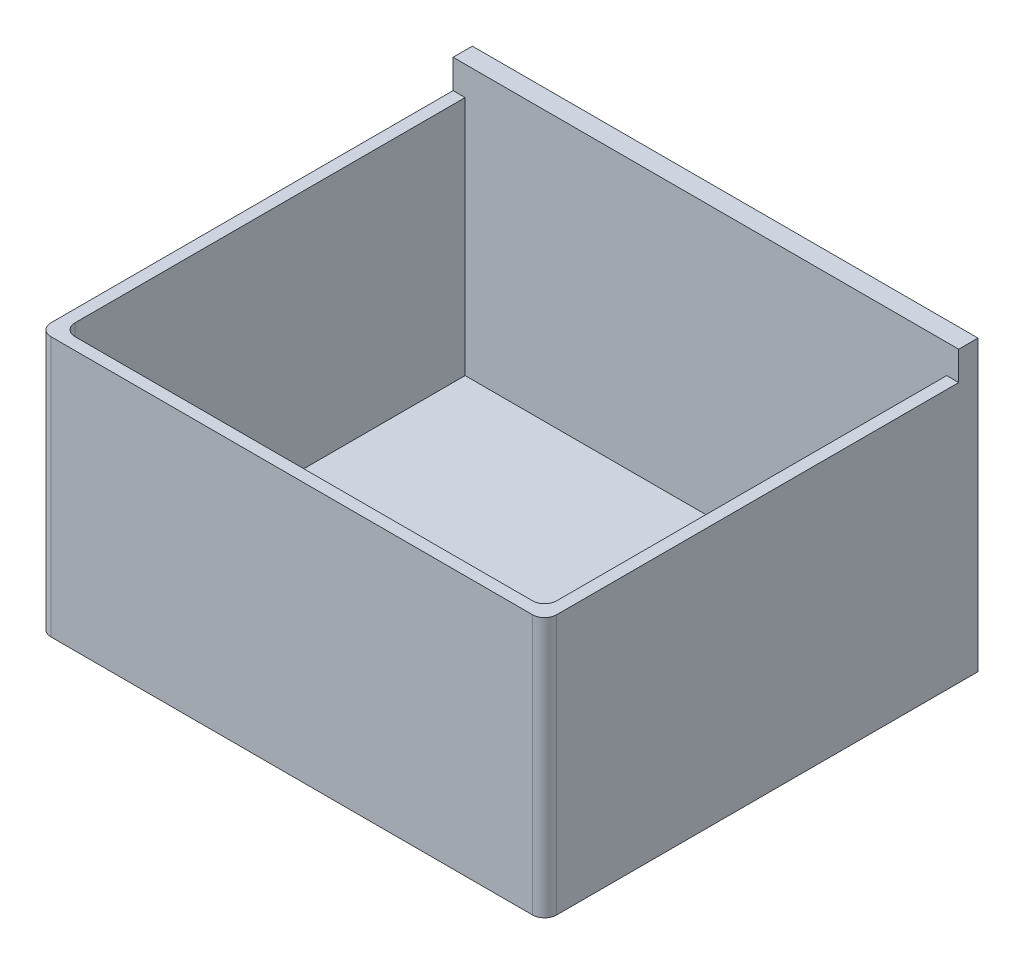
ISO-10303-21;
HEADER;
FILE_DESCRIPTION(('STEP AP214'),'2;1');
FILE_NAME('part.step','',(''),(''),'','','');
FILE_SCHEMA(('AUTOMOTIVE_DESIGN { 1 0 10303 214 1 1 1 1 }'));
ENDSEC;
DATA;
#1=APPLICATION_CONTEXT('core data for automotive mechanical design processes');
#2=APPLICATION_PROTOCOL_DEFINITION('international standard','automotive_design',2000,#1);
#3=PRODUCT_CONTEXT('',#1,'mechanical');
#4=PRODUCT('Part','Part','',(#3));
#5=PRODUCT_RELATED_PRODUCT_CATEGORY('part','',(#4));
#6=PRODUCT_DEFINITION_FORMATION('','',#4);
#7=PRODUCT_DEFINITION_CONTEXT('part definition',#1,'design');
#8=PRODUCT_DEFINITION('design','',#6,#7);
#9=PRODUCT_DEFINITION_SHAPE('','',#8);
#10=(LENGTH_UNIT() NAMED_UNIT(*) SI_UNIT(.MILLI.,.METRE.));
#11=(NAMED_UNIT(*) PLANE_ANGLE_UNIT() SI_UNIT($,.RADIAN.));
#12=(NAMED_UNIT(*) SI_UNIT($,.STERADIAN.) SOLID_ANGLE_UNIT());
#13=UNCERTAINTY_MEASURE_WITH_UNIT(LENGTH_MEASURE(1.E-05),#10,'distance_accuracy_value','');
#14=(GEOMETRIC_REPRESENTATION_CONTEXT(3) GLOBAL_UNCERTAINTY_ASSIGNED_CONTEXT((#13)) GLOBAL_UNIT_ASSIGNED_CONTEXT((#10,
#11,#12)) REPRESENTATION_CONTEXT('',''));
#15=CARTESIAN_POINT('',(0.,0.,0.));
#16=DIRECTION('',(0.,0.,1.));
#17=DIRECTION('',(1.,0.,0.));
#18=AXIS2_PLACEMENT_3D('',#15,#16,#17);
#19=CARTESIAN_POINT('',(210.,8.00000000000001,7.99999999999999));
#20=DIRECTION('',(0.,-1.,0.));
#21=DIRECTION('',(0.,0.,-1.));
#22=AXIS2_PLACEMENT_3D('',#19,#20,#21);
#23=PLANE('',#22);
#24=CARTESIAN_POINT('',(81.,8.,140.));
#25=DIRECTION('',(0.,-1.,0.));
#26=DIRECTION('',(0.,0.,-1.));
#27=AXIS2_PLACEMENT_3D('',#24,#25,#26);
#28=CIRCLE('',#27,2.75000000000001);
#29=CARTESIAN_POINT('',(81.,8.,137.25));
#30=VERTEX_POINT('',#29);
#31=EDGE_CURVE('E335',#30,#30,#28,.T.);
#32=ORIENTED_EDGE('',*,*,#31,.T.);
#33=EDGE_LOOP('',(#32));
#34=FACE_BOUND('',#33,.T.);
#35=CARTESIAN_POINT('',(129.,8.,140.));
#36=DIRECTION('',(0.,-1.,0.));
#37=DIRECTION('',(0.,0.,-1.));
#38=AXIS2_PLACEMENT_3D('',#35,#36,#37);
#39=CIRCLE('',#38,2.74999999999998);
#40=CARTESIAN_POINT('',(129.,8.,137.25));
#41=VERTEX_POINT('',#40);
#42=EDGE_CURVE('E337',#41,#41,#39,.F.);
#43=ORIENTED_EDGE('',*,*,#42,.F.);
#44=EDGE_LOOP('',(#43));
#45=FACE_BOUND('',#44,.T.);
#46=CARTESIAN_POINT('',(186.,8.,140.));
#47=DIRECTION('',(0.,-1.,0.));
#48=DIRECTION('',(0.,0.,-1.));
#49=AXIS2_PLACEMENT_3D('',#46,#47,#48);
#50=CIRCLE('',#49,2.74999999999998);
#51=CARTESIAN_POINT('',(186.,8.,137.25));
#52=VERTEX_POINT('',#51);
#53=EDGE_CURVE('E342',#52,#52,#50,.F.);
#54=ORIENTED_EDGE('',*,*,#53,.F.);
#55=EDGE_LOOP('',(#54));
#56=FACE_BOUND('',#55,.T.);
#57=DIRECTION('',(0.,0.,-1.));
#58=VECTOR('',#57,1.);
#59=CARTESIAN_POINT('',(5.,8.00000000000001,7.99999999999999));
#60=LINE('',#59,#58);
#61=CARTESIAN_POINT('',(5.00000000000002,8.,170.));
#62=VERTEX_POINT('',#61);
#63=CARTESIAN_POINT('',(5.,8.00000000000001,7.99999999999999));
#64=VERTEX_POINT('',#63);
#65=EDGE_CURVE('E254',#62,#64,#60,.T.);
#66=ORIENTED_EDGE('',*,*,#65,.F.);
#67=CARTESIAN_POINT('',(10.,7.99999999999999,170.));
#68=DIRECTION('',(0.,-1.,0.));
#69=DIRECTION('',(0.,0.,-1.));
#70=AXIS2_PLACEMENT_3D('',#67,#68,#69);
#71=CIRCLE('',#70,5.);
#72=CARTESIAN_POINT('',(10.,8.,175.));
#73=VERTEX_POINT('',#72);
#74=EDGE_CURVE('E190',#62,#73,#71,.F.);
#75=ORIENTED_EDGE('',*,*,#74,.T.);
#76=DIRECTION('',(-1.,0.,0.));
#77=VECTOR('',#76,1.);
#78=CARTESIAN_POINT('',(5.00000000000002,8.,175.));
#79=LINE('',#78,#77);
#80=CARTESIAN_POINT('',(200.,8.,175.));
#81=VERTEX_POINT('',#80);
#82=EDGE_CURVE('E252',#81,#73,#79,.T.);
#83=ORIENTED_EDGE('',*,*,#82,.F.);
#84=CARTESIAN_POINT('',(200.,7.99999999999999,170.));
#85=DIRECTION('',(0.,-1.,0.));
#86=DIRECTION('',(0.,0.,-1.));
#87=AXIS2_PLACEMENT_3D('',#84,#85,#86);
#88=CIRCLE('',#87,5.);
#89=CARTESIAN_POINT('',(205.,8.,170.));
#90=VERTEX_POINT('',#89);
#91=EDGE_CURVE('E181',#81,#90,#88,.F.);
#92=ORIENTED_EDGE('',*,*,#91,.T.);
#93=DIRECTION('',(0.,0.,1.));
#94=VECTOR('',#93,1.);
#95=CARTESIAN_POINT('',(205.,8.,175.));
#96=LINE('',#95,#94);
#97=CARTESIAN_POINT('',(205.,8.00000000000001,7.99999999999999));
#98=VERTEX_POINT('',#97);
#99=EDGE_CURVE('E259',#98,#90,#96,.T.);
#100=ORIENTED_EDGE('',*,*,#99,.F.);
#101=DIRECTION('',(-1.,0.,0.));
#102=VECTOR('',#101,1.);
#103=CARTESIAN_POINT('',(210.,8.00000000000001,7.99999999999999));
#104=LINE('',#103,#102);
#105=EDGE_CURVE('E293',#98,#64,#104,.T.);
#106=ORIENTED_EDGE('',*,*,#105,.T.);
#107=EDGE_LOOP('',(#66,#75,#83,#92,#100,#106));
#108=FACE_BOUND('',#107,.T.);
#109=CARTESIAN_POINT('',(24.,8.,140.));
#110=DIRECTION('',(0.,-1.,0.));
#111=DIRECTION('',(0.,0.,-1.));
#112=AXIS2_PLACEMENT_3D('',#109,#110,#111);
#113=CIRCLE('',#112,2.75);
#114=CARTESIAN_POINT('',(24.,8.,137.25));
#115=VERTEX_POINT('',#114);
#116=EDGE_CURVE('E266',#115,#115,#113,.T.);
#117=ORIENTED_EDGE('',*,*,#116,.T.);
#118=EDGE_LOOP('',(#117));
#119=FACE_BOUND('',#118,.T.);
#120=ADVANCED_FACE('F42',(#34,#45,#56,#108,#119),#23,.F.);
#121=CARTESIAN_POINT('',(210.,0.,180.));
#122=DIRECTION('',(0.,1.,0.));
#123=DIRECTION('',(0.,0.,1.));
#124=AXIS2_PLACEMENT_3D('',#121,#122,#123);
#125=PLANE('',#124);
#126=CARTESIAN_POINT('',(81.,0.,140.));
#127=DIRECTION('',(0.,-1.,0.));
#128=DIRECTION('',(0.,0.,-1.));
#129=AXIS2_PLACEMENT_3D('',#126,#127,#128);
#130=CIRCLE('',#129,2.75000000000001);
#131=CARTESIAN_POINT('',(81.,0.,137.25));
#132=VERTEX_POINT('',#131);
#133=EDGE_CURVE('E355',#132,#132,#130,.T.);
#134=ORIENTED_EDGE('',*,*,#133,.F.);
#135=EDGE_LOOP('',(#134));
#136=FACE_BOUND('',#135,.T.);
#137=CARTESIAN_POINT('',(129.,0.,140.));
#138=DIRECTION('',(0.,1.,0.));
#139=DIRECTION('',(0.,0.,1.));
#140=AXIS2_PLACEMENT_3D('',#137,#138,#139);
#141=CIRCLE('',#140,2.74999999999998);
#142=CARTESIAN_POINT('',(129.,0.,142.75));
#143=VERTEX_POINT('',#142);
#144=EDGE_CURVE('E352',#143,#143,#141,.T.);
#145=ORIENTED_EDGE('',*,*,#144,.T.);
#146=EDGE_LOOP('',(#145));
#147=FACE_BOUND('',#146,.T.);
#148=CARTESIAN_POINT('',(186.,0.,140.));
#149=DIRECTION('',(0.,1.,0.));
#150=DIRECTION('',(0.,0.,1.));
#151=AXIS2_PLACEMENT_3D('',#148,#149,#150);
#152=CIRCLE('',#151,2.74999999999998);
#153=CARTESIAN_POINT('',(186.,0.,142.75));
#154=VERTEX_POINT('',#153);
#155=EDGE_CURVE('E349',#154,#154,#152,.T.);
#156=ORIENTED_EDGE('',*,*,#155,.T.);
#157=EDGE_LOOP('',(#156));
#158=FACE_BOUND('',#157,.T.);
#159=DIRECTION('',(-1.,0.,0.));
#160=VECTOR('',#159,1.);
#161=CARTESIAN_POINT('',(210.,0.,180.));
#162=LINE('',#161,#160);
#163=CARTESIAN_POINT('',(205.,0.,180.));
#164=VERTEX_POINT('',#163);
#165=CARTESIAN_POINT('',(5.,0.,180.));
#166=VERTEX_POINT('',#165);
#167=EDGE_CURVE('E281',#164,#166,#162,.T.);
#168=ORIENTED_EDGE('',*,*,#167,.T.);
#169=CARTESIAN_POINT('',(5.,0.,175.));
#170=DIRECTION('',(0.,1.,0.));
#171=DIRECTION('',(0.,0.,1.));
#172=AXIS2_PLACEMENT_3D('',#169,#170,#171);
#173=CIRCLE('',#172,5.);
#174=CARTESIAN_POINT('',(0.,0.,175.));
#175=VERTEX_POINT('',#174);
#176=EDGE_CURVE('E210',#166,#175,#173,.F.);
#177=ORIENTED_EDGE('',*,*,#176,.T.);
#178=DIRECTION('',(0.,0.,-1.));
#179=VECTOR('',#178,1.);
#180=CARTESIAN_POINT('',(0.,0.,180.));
#181=LINE('',#180,#179);
#182=CARTESIAN_POINT('',(0.,0.,0.));
#183=VERTEX_POINT('',#182);
#184=EDGE_CURVE('E172',#175,#183,#181,.T.);
#185=ORIENTED_EDGE('',*,*,#184,.T.);
#186=DIRECTION('',(-1.,0.,0.));
#187=VECTOR('',#186,1.);
#188=CARTESIAN_POINT('',(210.,0.,0.));
#189=LINE('',#188,#187);
#190=CARTESIAN_POINT('',(210.,0.,0.));
#191=VERTEX_POINT('',#190);
#192=EDGE_CURVE('E161',#191,#183,#189,.T.);
#193=ORIENTED_EDGE('',*,*,#192,.F.);
#194=DIRECTION('',(0.,0.,-1.));
#195=VECTOR('',#194,1.);
#196=CARTESIAN_POINT('',(210.,0.,180.));
#197=LINE('',#196,#195);
#198=CARTESIAN_POINT('',(210.,0.,175.));
#199=VERTEX_POINT('',#198);
#200=EDGE_CURVE('E146',#199,#191,#197,.T.);
#201=ORIENTED_EDGE('',*,*,#200,.F.);
#202=CARTESIAN_POINT('',(205.,0.,175.));
#203=DIRECTION('',(0.,1.,0.));
#204=DIRECTION('',(0.,0.,1.));
#205=AXIS2_PLACEMENT_3D('',#202,#203,#204);
#206=CIRCLE('',#205,5.);
#207=EDGE_CURVE('E207',#199,#164,#206,.F.);
#208=ORIENTED_EDGE('',*,*,#207,.T.);
#209=EDGE_LOOP('',(#168,#177,#185,#193,#201,#208));
#210=FACE_BOUND('',#209,.T.);
#211=CARTESIAN_POINT('',(24.,0.,140.));
#212=DIRECTION('',(0.,-1.,0.));
#213=DIRECTION('',(0.,0.,-1.));
#214=AXIS2_PLACEMENT_3D('',#211,#212,#213);
#215=CIRCLE('',#214,2.75);
#216=CARTESIAN_POINT('',(24.,0.,137.25));
#217=VERTEX_POINT('',#216);
#218=EDGE_CURVE('E348',#217,#217,#215,.T.);
#219=ORIENTED_EDGE('',*,*,#218,.F.);
#220=EDGE_LOOP('',(#219));
#221=FACE_BOUND('',#220,.T.);
#222=ADVANCED_FACE('F169',(#136,#147,#158,#210,#221),#125,.F.);
#223=CARTESIAN_POINT('',(210.,120.,8.));
#224=DIRECTION('',(0.,0.,-1.));
#225=DIRECTION('',(0.,1.,0.));
#226=AXIS2_PLACEMENT_3D('',#223,#224,#225);
#227=PLANE('',#226);
#228=DIRECTION('',(0.,-1.,0.));
#229=VECTOR('',#228,1.);
#230=CARTESIAN_POINT('',(5.,108.,8.));
#231=LINE('',#230,#229);
#232=CARTESIAN_POINT('',(5.,108.,8.));
#233=VERTEX_POINT('',#232);
#234=EDGE_CURVE('E244',#233,#64,#231,.T.);
#235=ORIENTED_EDGE('',*,*,#234,.T.);
#236=ORIENTED_EDGE('',*,*,#105,.F.);
#237=DIRECTION('',(0.,-1.,0.));
#238=VECTOR('',#237,1.);
#239=CARTESIAN_POINT('',(205.,108.,8.00000000000001));
#240=LINE('',#239,#238);
#241=CARTESIAN_POINT('',(205.,108.,8.));
#242=VERTEX_POINT('',#241);
#243=EDGE_CURVE('E271',#242,#98,#240,.T.);
#244=ORIENTED_EDGE('',*,*,#243,.F.);
#245=DIRECTION('',(-1.,0.,0.));
#246=VECTOR('',#245,1.);
#247=CARTESIAN_POINT('',(210.,108.,8.));
#248=LINE('',#247,#246);
#249=CARTESIAN_POINT('',(210.,108.,8.));
#250=VERTEX_POINT('',#249);
#251=EDGE_CURVE('E326',#250,#242,#248,.T.);
#252=ORIENTED_EDGE('',*,*,#251,.F.);
#253=DIRECTION('',(0.,-1.,0.));
#254=VECTOR('',#253,1.);
#255=CARTESIAN_POINT('',(210.,120.,8.));
#256=LINE('',#255,#254);
#257=CARTESIAN_POINT('',(210.,120.,8.));
#258=VERTEX_POINT('',#257);
#259=EDGE_CURVE('E277',#258,#250,#256,.T.);
#260=ORIENTED_EDGE('',*,*,#259,.F.);
#261=DIRECTION('',(-1.,0.,0.));
#262=VECTOR('',#261,1.);
#263=CARTESIAN_POINT('',(210.,120.,8.));
#264=LINE('',#263,#262);
#265=CARTESIAN_POINT('',(0.,120.,8.));
#266=VERTEX_POINT('',#265);
#267=EDGE_CURVE('E184',#258,#266,#264,.T.);
#268=ORIENTED_EDGE('',*,*,#267,.T.);
#269=DIRECTION('',(0.,-1.,0.));
#270=VECTOR('',#269,1.);
#271=CARTESIAN_POINT('',(0.,120.,8.));
#272=LINE('',#271,#270);
#273=CARTESIAN_POINT('',(0.,108.,8.));
#274=VERTEX_POINT('',#273);
#275=EDGE_CURVE('E156',#266,#274,#272,.T.);
#276=ORIENTED_EDGE('',*,*,#275,.T.);
#277=DIRECTION('',(-1.,0.,0.));
#278=VECTOR('',#277,1.);
#279=CARTESIAN_POINT('',(5.,108.,8.));
#280=LINE('',#279,#278);
#281=EDGE_CURVE('E263',#233,#274,#280,.T.);
#282=ORIENTED_EDGE('',*,*,#281,.F.);
#283=EDGE_LOOP('',(#235,#236,#244,#252,#260,#268,#276,#282));
#284=FACE_BOUND('',#283,.T.);
#285=ADVANCED_FACE('F302',(#284),#227,.F.);
#286=CARTESIAN_POINT('',(210.,0.,0.));
#287=DIRECTION('',(0.,0.,1.));
#288=DIRECTION('',(1.,0.,0.));
#289=AXIS2_PLACEMENT_3D('',#286,#287,#288);
#290=PLANE('',#289);
#291=DIRECTION('',(0.,1.,0.));
#292=VECTOR('',#291,1.);
#293=CARTESIAN_POINT('',(0.,0.,0.));
#294=LINE('',#293,#292);
#295=CARTESIAN_POINT('',(0.,120.,0.));
#296=VERTEX_POINT('',#295);
#297=EDGE_CURVE('E284',#183,#296,#294,.T.);
#298=ORIENTED_EDGE('',*,*,#297,.T.);
#299=DIRECTION('',(-1.,0.,0.));
#300=VECTOR('',#299,1.);
#301=CARTESIAN_POINT('',(210.,120.,0.));
#302=LINE('',#301,#300);
#303=CARTESIAN_POINT('',(210.,120.,0.));
#304=VERTEX_POINT('',#303);
#305=EDGE_CURVE('E163',#304,#296,#302,.T.);
#306=ORIENTED_EDGE('',*,*,#305,.F.);
#307=DIRECTION('',(0.,1.,0.));
#308=VECTOR('',#307,1.);
#309=CARTESIAN_POINT('',(210.,0.,0.));
#310=LINE('',#309,#308);
#311=EDGE_CURVE('E149',#191,#304,#310,.T.);
#312=ORIENTED_EDGE('',*,*,#311,.F.);
#313=ORIENTED_EDGE('',*,*,#192,.T.);
#314=EDGE_LOOP('',(#298,#306,#312,#313));
#315=FACE_BOUND('',#314,.T.);
#316=ADVANCED_FACE('F160',(#315),#290,.F.);
#317=CARTESIAN_POINT('',(210.,120.,0.));
#318=DIRECTION('',(0.,-1.,0.));
#319=DIRECTION('',(0.,0.,-1.));
#320=AXIS2_PLACEMENT_3D('',#317,#318,#319);
#321=PLANE('',#320);
#322=DIRECTION('',(0.,0.,1.));
#323=VECTOR('',#322,1.);
#324=CARTESIAN_POINT('',(0.,120.,0.));
#325=LINE('',#324,#323);
#326=EDGE_CURVE('E287',#296,#266,#325,.T.);
#327=ORIENTED_EDGE('',*,*,#326,.T.);
#328=ORIENTED_EDGE('',*,*,#267,.F.);
#329=DIRECTION('',(0.,0.,1.));
#330=VECTOR('',#329,1.);
#331=CARTESIAN_POINT('',(210.,120.,0.));
#332=LINE('',#331,#330);
#333=EDGE_CURVE('E166',#304,#258,#332,.T.);
#334=ORIENTED_EDGE('',*,*,#333,.F.);
#335=ORIENTED_EDGE('',*,*,#305,.T.);
#336=EDGE_LOOP('',(#327,#328,#334,#335));
#337=FACE_BOUND('',#336,.T.);
#338=ADVANCED_FACE('F393',(#337),#321,.F.);
#339=CARTESIAN_POINT('',(210.,8.,180.));
#340=DIRECTION('',(0.,0.,-1.));
#341=DIRECTION('',(-1.,0.,0.));
#342=AXIS2_PLACEMENT_3D('',#339,#340,#341);
#343=PLANE('',#342);
#344=DIRECTION('',(1.,0.,0.));
#345=VECTOR('',#344,1.);
#346=CARTESIAN_POINT('',(0.,108.,180.));
#347=LINE('',#346,#345);
#348=CARTESIAN_POINT('',(5.,108.,180.));
#349=VERTEX_POINT('',#348);
#350=CARTESIAN_POINT('',(205.,108.,180.));
#351=VERTEX_POINT('',#350);
#352=EDGE_CURVE('E313',#349,#351,#347,.T.);
#353=ORIENTED_EDGE('',*,*,#352,.F.);
#354=DIRECTION('',(0.,-1.,0.));
#355=VECTOR('',#354,1.);
#356=CARTESIAN_POINT('',(5.,8.,180.));
#357=LINE('',#356,#355);
#358=EDGE_CURVE('E203',#349,#166,#357,.T.);
#359=ORIENTED_EDGE('',*,*,#358,.T.);
#360=ORIENTED_EDGE('',*,*,#167,.F.);
#361=DIRECTION('',(0.,-1.,0.));
#362=VECTOR('',#361,1.);
#363=CARTESIAN_POINT('',(205.,108.,180.));
#364=LINE('',#363,#362);
#365=EDGE_CURVE('E200',#164,#351,#364,.F.);
#366=ORIENTED_EDGE('',*,*,#365,.T.);
#367=EDGE_LOOP('',(#353,#359,#360,#366));
#368=FACE_BOUND('',#367,.T.);
#369=ADVANCED_FACE('F395',(#368),#343,.F.);
#370=CARTESIAN_POINT('',(210.,0.,0.));
#371=DIRECTION('',(1.,0.,0.));
#372=DIRECTION('',(0.,0.,-1.));
#373=AXIS2_PLACEMENT_3D('',#370,#371,#372);
#374=PLANE('',#373);
#375=DIRECTION('',(0.,0.,-1.));
#376=VECTOR('',#375,1.);
#377=CARTESIAN_POINT('',(210.,108.,180.));
#378=LINE('',#377,#376);
#379=CARTESIAN_POINT('',(210.,108.,175.));
#380=VERTEX_POINT('',#379);
#381=EDGE_CURVE('E323',#380,#250,#378,.T.);
#382=ORIENTED_EDGE('',*,*,#381,.F.);
#383=DIRECTION('',(0.,-1.,0.));
#384=VECTOR('',#383,1.);
#385=CARTESIAN_POINT('',(210.,0.,175.));
#386=LINE('',#385,#384);
#387=EDGE_CURVE('E152',#380,#199,#386,.T.);
#388=ORIENTED_EDGE('',*,*,#387,.T.);
#389=ORIENTED_EDGE('',*,*,#200,.T.);
#390=ORIENTED_EDGE('',*,*,#311,.T.);
#391=ORIENTED_EDGE('',*,*,#333,.T.);
#392=ORIENTED_EDGE('',*,*,#259,.T.);
#393=EDGE_LOOP('',(#382,#388,#389,#390,#391,#392));
#394=FACE_BOUND('',#393,.T.);
#395=ADVANCED_FACE('F148',(#394),#374,.T.);
#396=CARTESIAN_POINT('',(0.,0.,0.));
#397=DIRECTION('',(1.,0.,0.));
#398=DIRECTION('',(0.,0.,-1.));
#399=AXIS2_PLACEMENT_3D('',#396,#397,#398);
#400=PLANE('',#399);
#401=ORIENTED_EDGE('',*,*,#184,.F.);
#402=DIRECTION('',(0.,-1.,0.));
#403=VECTOR('',#402,1.);
#404=CARTESIAN_POINT('',(0.,0.,175.));
#405=LINE('',#404,#403);
#406=CARTESIAN_POINT('',(0.,108.,175.));
#407=VERTEX_POINT('',#406);
#408=EDGE_CURVE('E213',#175,#407,#405,.F.);
#409=ORIENTED_EDGE('',*,*,#408,.T.);
#410=DIRECTION('',(0.,0.,1.));
#411=VECTOR('',#410,1.);
#412=CARTESIAN_POINT('',(0.,108.,8.));
#413=LINE('',#412,#411);
#414=EDGE_CURVE('E309',#274,#407,#413,.T.);
#415=ORIENTED_EDGE('',*,*,#414,.F.);
#416=ORIENTED_EDGE('',*,*,#275,.F.);
#417=ORIENTED_EDGE('',*,*,#326,.F.);
#418=ORIENTED_EDGE('',*,*,#297,.F.);
#419=EDGE_LOOP('',(#401,#409,#415,#416,#417,#418));
#420=FACE_BOUND('',#419,.T.);
#421=ADVANCED_FACE('F308',(#420),#400,.F.);
#422=CARTESIAN_POINT('',(205.,108.,175.));
#423=DIRECTION('',(1.,0.,0.));
#424=DIRECTION('',(0.,0.,-1.));
#425=AXIS2_PLACEMENT_3D('',#422,#423,#424);
#426=PLANE('',#425);
#427=ORIENTED_EDGE('',*,*,#99,.T.);
#428=DIRECTION('',(0.,-1.,0.));
#429=VECTOR('',#428,1.);
#430=CARTESIAN_POINT('',(205.,108.,170.));
#431=LINE('',#430,#429);
#432=CARTESIAN_POINT('',(205.,108.,170.));
#433=VERTEX_POINT('',#432);
#434=EDGE_CURVE('E58',#90,#433,#431,.F.);
#435=ORIENTED_EDGE('',*,*,#434,.T.);
#436=DIRECTION('',(0.,0.,1.));
#437=VECTOR('',#436,1.);
#438=CARTESIAN_POINT('',(205.,108.,175.));
#439=LINE('',#438,#437);
#440=EDGE_CURVE('E330',#242,#433,#439,.T.);
#441=ORIENTED_EDGE('',*,*,#440,.F.);
#442=ORIENTED_EDGE('',*,*,#243,.T.);
#443=EDGE_LOOP('',(#427,#435,#441,#442));
#444=FACE_BOUND('',#443,.T.);
#445=ADVANCED_FACE('F391',(#444),#426,.F.);
#446=CARTESIAN_POINT('',(5.00000000000002,108.,175.));
#447=DIRECTION('',(0.,0.,1.));
#448=DIRECTION('',(0.,-1.,0.));
#449=AXIS2_PLACEMENT_3D('',#446,#447,#448);
#450=PLANE('',#449);
#451=ORIENTED_EDGE('',*,*,#82,.T.);
#452=DIRECTION('',(0.,-1.,0.));
#453=VECTOR('',#452,1.);
#454=CARTESIAN_POINT('',(10.,108.,175.));
#455=LINE('',#454,#453);
#456=CARTESIAN_POINT('',(10.,108.,175.));
#457=VERTEX_POINT('',#456);
#458=EDGE_CURVE('E197',#73,#457,#455,.F.);
#459=ORIENTED_EDGE('',*,*,#458,.T.);
#460=DIRECTION('',(-1.,0.,0.));
#461=VECTOR('',#460,1.);
#462=CARTESIAN_POINT('',(5.00000000000002,108.,175.));
#463=LINE('',#462,#461);
#464=CARTESIAN_POINT('',(200.,108.,175.));
#465=VERTEX_POINT('',#464);
#466=EDGE_CURVE('E235',#465,#457,#463,.T.);
#467=ORIENTED_EDGE('',*,*,#466,.F.);
#468=DIRECTION('',(0.,-1.,0.));
#469=VECTOR('',#468,1.);
#470=CARTESIAN_POINT('',(200.,8.00000000000001,175.));
#471=LINE('',#470,#469);
#472=EDGE_CURVE('E193',#465,#81,#471,.T.);
#473=ORIENTED_EDGE('',*,*,#472,.T.);
#474=EDGE_LOOP('',(#451,#459,#467,#473));
#475=FACE_BOUND('',#474,.T.);
#476=ADVANCED_FACE('F256',(#475),#450,.F.);
#477=CARTESIAN_POINT('',(5.,108.,8.));
#478=DIRECTION('',(-1.,0.,0.));
#479=DIRECTION('',(0.,0.,1.));
#480=AXIS2_PLACEMENT_3D('',#477,#478,#479);
#481=PLANE('',#480);
#482=DIRECTION('',(0.,0.,-1.));
#483=VECTOR('',#482,1.);
#484=CARTESIAN_POINT('',(5.,108.,8.));
#485=LINE('',#484,#483);
#486=CARTESIAN_POINT('',(5.00000000000002,108.,170.));
#487=VERTEX_POINT('',#486);
#488=EDGE_CURVE('E232',#487,#233,#485,.T.);
#489=ORIENTED_EDGE('',*,*,#488,.F.);
#490=DIRECTION('',(0.,-1.,0.));
#491=VECTOR('',#490,1.);
#492=CARTESIAN_POINT('',(5.00000000000002,7.99999999999999,170.));
#493=LINE('',#492,#491);
#494=EDGE_CURVE('E175',#487,#62,#493,.T.);
#495=ORIENTED_EDGE('',*,*,#494,.T.);
#496=ORIENTED_EDGE('',*,*,#65,.T.);
#497=ORIENTED_EDGE('',*,*,#234,.F.);
#498=EDGE_LOOP('',(#489,#495,#496,#497));
#499=FACE_BOUND('',#498,.T.);
#500=ADVANCED_FACE('F241',(#499),#481,.F.);
#501=CARTESIAN_POINT('',(0.,108.,0.));
#502=DIRECTION('',(0.,1.,0.));
#503=DIRECTION('',(0.,0.,1.));
#504=AXIS2_PLACEMENT_3D('',#501,#502,#503);
#505=PLANE('',#504);
#506=ORIENTED_EDGE('',*,*,#414,.T.);
#507=CARTESIAN_POINT('',(5.,108.,175.));
#508=DIRECTION('',(0.,1.,0.));
#509=DIRECTION('',(0.,0.,1.));
#510=AXIS2_PLACEMENT_3D('',#507,#508,#509);
#511=CIRCLE('',#510,5.);
#512=EDGE_CURVE('E218',#407,#349,#511,.T.);
#513=ORIENTED_EDGE('',*,*,#512,.T.);
#514=ORIENTED_EDGE('',*,*,#352,.T.);
#515=CARTESIAN_POINT('',(205.,108.,175.));
#516=DIRECTION('',(0.,1.,0.));
#517=DIRECTION('',(0.,0.,1.));
#518=AXIS2_PLACEMENT_3D('',#515,#516,#517);
#519=CIRCLE('',#518,5.);
#520=EDGE_CURVE('E66',#351,#380,#519,.T.);
#521=ORIENTED_EDGE('',*,*,#520,.T.);
#522=ORIENTED_EDGE('',*,*,#381,.T.);
#523=ORIENTED_EDGE('',*,*,#251,.T.);
#524=ORIENTED_EDGE('',*,*,#440,.T.);
#525=CARTESIAN_POINT('',(200.,108.,170.));
#526=DIRECTION('',(0.,1.,0.));
#527=DIRECTION('',(0.,0.,1.));
#528=AXIS2_PLACEMENT_3D('',#525,#526,#527);
#529=CIRCLE('',#528,5.);
#530=EDGE_CURVE('E11',#433,#465,#529,.F.);
#531=ORIENTED_EDGE('',*,*,#530,.T.);
#532=ORIENTED_EDGE('',*,*,#466,.T.);
#533=CARTESIAN_POINT('',(10.,108.,170.));
#534=DIRECTION('',(0.,1.,0.));
#535=DIRECTION('',(0.,0.,1.));
#536=AXIS2_PLACEMENT_3D('',#533,#534,#535);
#537=CIRCLE('',#536,5.);
#538=EDGE_CURVE('E51',#457,#487,#537,.F.);
#539=ORIENTED_EDGE('',*,*,#538,.T.);
#540=ORIENTED_EDGE('',*,*,#488,.T.);
#541=ORIENTED_EDGE('',*,*,#281,.T.);
#542=EDGE_LOOP('',(#506,#513,#514,#521,#522,#523,#524,#531,#532,#539,#540,#541));
#543=FACE_BOUND('',#542,.T.);
#544=ADVANCED_FACE('F230',(#543),#505,.T.);
#545=CARTESIAN_POINT('',(186.,20.,140.));
#546=DIRECTION('',(0.,-1.,0.));
#547=DIRECTION('',(0.,0.,-1.));
#548=AXIS2_PLACEMENT_3D('',#545,#546,#547);
#549=CYLINDRICAL_SURFACE('',#548,2.74999999999998);
#550=ORIENTED_EDGE('',*,*,#155,.F.);
#551=EDGE_LOOP('',(#550));
#552=FACE_BOUND('',#551,.T.);
#553=ORIENTED_EDGE('',*,*,#53,.T.);
#554=EDGE_LOOP('',(#553));
#555=FACE_BOUND('',#554,.T.);
#556=ADVANCED_FACE('F415',(#552,#555),#549,.F.);
#557=CARTESIAN_POINT('',(129.,20.,140.));
#558=DIRECTION('',(0.,-1.,0.));
#559=DIRECTION('',(0.,0.,-1.));
#560=AXIS2_PLACEMENT_3D('',#557,#558,#559);
#561=CYLINDRICAL_SURFACE('',#560,2.74999999999998);
#562=ORIENTED_EDGE('',*,*,#144,.F.);
#563=EDGE_LOOP('',(#562));
#564=FACE_BOUND('',#563,.T.);
#565=ORIENTED_EDGE('',*,*,#42,.T.);
#566=EDGE_LOOP('',(#565));
#567=FACE_BOUND('',#566,.T.);
#568=ADVANCED_FACE('F418',(#564,#567),#561,.F.);
#569=CARTESIAN_POINT('',(81.,20.,140.));
#570=DIRECTION('',(0.,-1.,0.));
#571=DIRECTION('',(0.,0.,-1.));
#572=AXIS2_PLACEMENT_3D('',#569,#570,#571);
#573=CYLINDRICAL_SURFACE('',#572,2.75000000000001);
#574=ORIENTED_EDGE('',*,*,#133,.T.);
#575=EDGE_LOOP('',(#574));
#576=FACE_BOUND('',#575,.T.);
#577=ORIENTED_EDGE('',*,*,#31,.F.);
#578=EDGE_LOOP('',(#577));
#579=FACE_BOUND('',#578,.T.);
#580=ADVANCED_FACE('F422',(#576,#579),#573,.F.);
#581=CARTESIAN_POINT('',(24.,20.,140.));
#582=DIRECTION('',(0.,-1.,0.));
#583=DIRECTION('',(0.,0.,-1.));
#584=AXIS2_PLACEMENT_3D('',#581,#582,#583);
#585=CYLINDRICAL_SURFACE('',#584,2.75);
#586=ORIENTED_EDGE('',*,*,#218,.T.);
#587=EDGE_LOOP('',(#586));
#588=FACE_BOUND('',#587,.T.);
#589=ORIENTED_EDGE('',*,*,#116,.F.);
#590=EDGE_LOOP('',(#589));
#591=FACE_BOUND('',#590,.T.);
#592=ADVANCED_FACE('F362',(#588,#591),#585,.F.);
#593=CARTESIAN_POINT('',(10.,108.,170.));
#594=DIRECTION('',(0.,1.,0.));
#595=DIRECTION('',(0.,0.,1.));
#596=AXIS2_PLACEMENT_3D('',#593,#594,#595);
#597=CYLINDRICAL_SURFACE('',#596,5.);
#598=ORIENTED_EDGE('',*,*,#538,.F.);
#599=ORIENTED_EDGE('',*,*,#458,.F.);
#600=ORIENTED_EDGE('',*,*,#74,.F.);
#601=ORIENTED_EDGE('',*,*,#494,.F.);
#602=EDGE_LOOP('',(#598,#599,#600,#601));
#603=FACE_BOUND('',#602,.T.);
#604=ADVANCED_FACE('F247',(#603),#597,.F.);
#605=CARTESIAN_POINT('',(5.,8.,175.));
#606=DIRECTION('',(0.,-1.,0.));
#607=DIRECTION('',(0.,0.,-1.));
#608=AXIS2_PLACEMENT_3D('',#605,#606,#607);
#609=CYLINDRICAL_SURFACE('',#608,5.);
#610=ORIENTED_EDGE('',*,*,#512,.F.);
#611=ORIENTED_EDGE('',*,*,#408,.F.);
#612=ORIENTED_EDGE('',*,*,#176,.F.);
#613=ORIENTED_EDGE('',*,*,#358,.F.);
#614=EDGE_LOOP('',(#610,#611,#612,#613));
#615=FACE_BOUND('',#614,.T.);
#616=ADVANCED_FACE('F380',(#615),#609,.T.);
#617=CARTESIAN_POINT('',(200.,108.,170.));
#618=DIRECTION('',(0.,1.,0.));
#619=DIRECTION('',(0.,0.,1.));
#620=AXIS2_PLACEMENT_3D('',#617,#618,#619);
#621=CYLINDRICAL_SURFACE('',#620,5.);
#622=ORIENTED_EDGE('',*,*,#530,.F.);
#623=ORIENTED_EDGE('',*,*,#434,.F.);
#624=ORIENTED_EDGE('',*,*,#91,.F.);
#625=ORIENTED_EDGE('',*,*,#472,.F.);
#626=EDGE_LOOP('',(#622,#623,#624,#625));
#627=FACE_BOUND('',#626,.T.);
#628=ADVANCED_FACE('F382',(#627),#621,.F.);
#629=CARTESIAN_POINT('',(205.,0.,175.));
#630=DIRECTION('',(0.,1.,0.));
#631=DIRECTION('',(0.,0.,1.));
#632=AXIS2_PLACEMENT_3D('',#629,#630,#631);
#633=CYLINDRICAL_SURFACE('',#632,5.);
#634=ORIENTED_EDGE('',*,*,#520,.F.);
#635=ORIENTED_EDGE('',*,*,#365,.F.);
#636=ORIENTED_EDGE('',*,*,#207,.F.);
#637=ORIENTED_EDGE('',*,*,#387,.F.);
#638=EDGE_LOOP('',(#634,#635,#636,#637));
#639=FACE_BOUND('',#638,.T.);
#640=ADVANCED_FACE('F44',(#639),#633,.T.);
#641=CLOSED_SHELL('',(#120,#222,#285,#316,#338,#369,#395,#421,#445,#476,#500,#544,#556,#568,
#580,#592,#604,#616,#628,#640));
#642=MANIFOLD_SOLID_BREP('B2',#641);
#643=ADVANCED_BREP_SHAPE_REPRESENTATION('',(#18,#642),#14);
#644=SHAPE_DEFINITION_REPRESENTATION(#9,#643);
ENDSEC;
END-ISO-10303-21;
